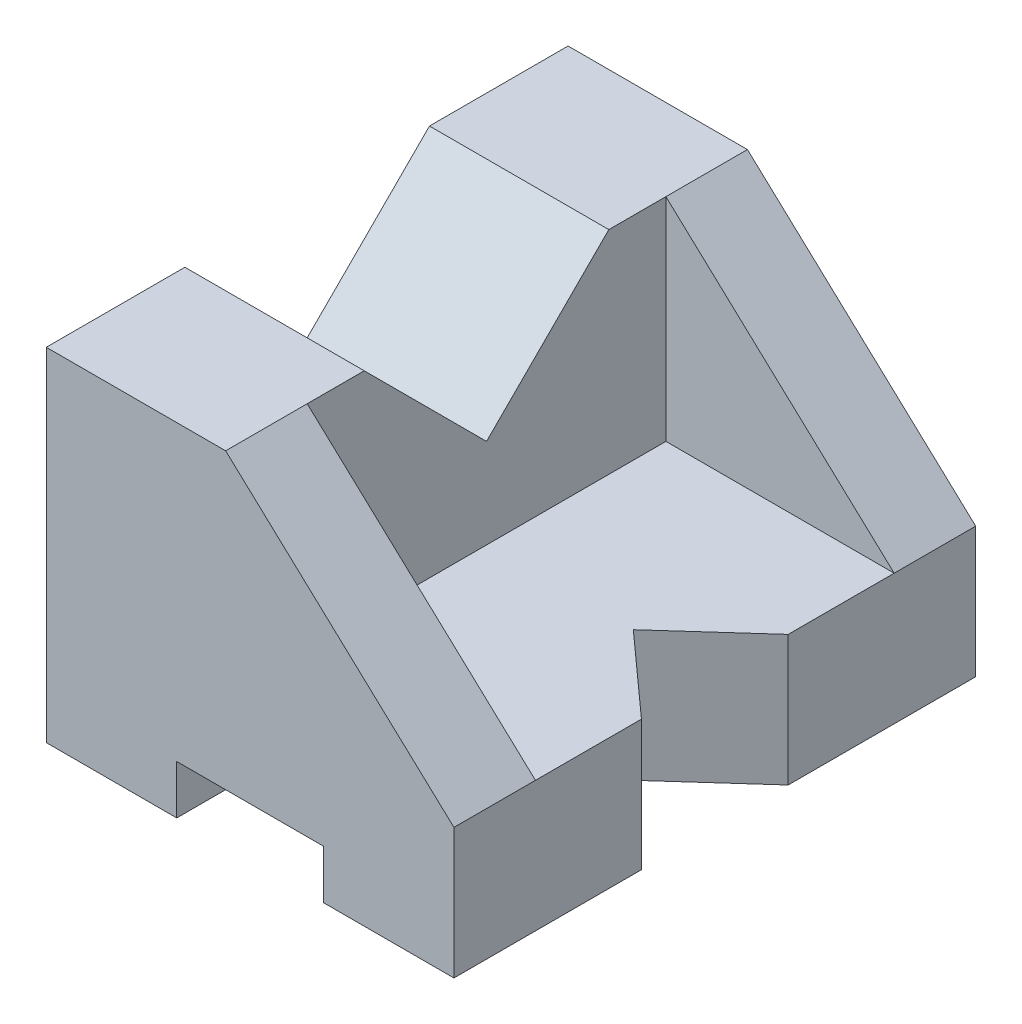
ISO-10303-21;
HEADER;
FILE_DESCRIPTION(('STEP AP214'),'2;1');
FILE_NAME('part.step','',(''),(''),'','','');
FILE_SCHEMA(('AUTOMOTIVE_DESIGN { 1 0 10303 214 1 1 1 1 }'));
ENDSEC;
DATA;
#1=APPLICATION_CONTEXT('core data for automotive mechanical design processes');
#2=APPLICATION_PROTOCOL_DEFINITION('international standard','automotive_design',2000,#1);
#3=PRODUCT_CONTEXT('',#1,'mechanical');
#4=PRODUCT('Part','Part','',(#3));
#5=PRODUCT_RELATED_PRODUCT_CATEGORY('part','',(#4));
#6=PRODUCT_DEFINITION_FORMATION('','',#4);
#7=PRODUCT_DEFINITION_CONTEXT('part definition',#1,'design');
#8=PRODUCT_DEFINITION('design','',#6,#7);
#9=PRODUCT_DEFINITION_SHAPE('','',#8);
#10=(LENGTH_UNIT() NAMED_UNIT(*) SI_UNIT(.MILLI.,.METRE.));
#11=(NAMED_UNIT(*) PLANE_ANGLE_UNIT() SI_UNIT($,.RADIAN.));
#12=(NAMED_UNIT(*) SI_UNIT($,.STERADIAN.) SOLID_ANGLE_UNIT());
#13=UNCERTAINTY_MEASURE_WITH_UNIT(LENGTH_MEASURE(1.E-05),#10,'distance_accuracy_value','');
#14=(GEOMETRIC_REPRESENTATION_CONTEXT(3) GLOBAL_UNCERTAINTY_ASSIGNED_CONTEXT((#13)) GLOBAL_UNIT_ASSIGNED_CONTEXT((#10,
#11,#12)) REPRESENTATION_CONTEXT('',''));
#15=CARTESIAN_POINT('',(0.,0.,0.));
#16=DIRECTION('',(0.,0.,1.));
#17=DIRECTION('',(1.,0.,0.));
#18=AXIS2_PLACEMENT_3D('',#15,#16,#17);
#19=CARTESIAN_POINT('',(50.,16.,-64.));
#20=DIRECTION('',(1.,0.,0.));
#21=DIRECTION('',(0.,0.,-1.));
#22=AXIS2_PLACEMENT_3D('',#19,#20,#21);
#23=PLANE('',#22);
#24=DIRECTION('',(0.,1.,0.));
#25=VECTOR('',#24,1.);
#26=CARTESIAN_POINT('',(50.,0.,-23.));
#27=LINE('',#26,#25);
#28=CARTESIAN_POINT('',(50.,0.,-23.));
#29=VERTEX_POINT('',#28);
#30=CARTESIAN_POINT('',(50.,16.,-23.));
#31=VERTEX_POINT('',#30);
#32=EDGE_CURVE('E163',#29,#31,#27,.T.);
#33=ORIENTED_EDGE('',*,*,#32,.T.);
#34=DIRECTION('',(0.,0.,1.));
#35=VECTOR('',#34,1.);
#36=CARTESIAN_POINT('',(50.,16.,-54.));
#37=LINE('',#36,#35);
#38=CARTESIAN_POINT('',(50.,16.,-10.));
#39=VERTEX_POINT('',#38);
#40=EDGE_CURVE('E230',#31,#39,#37,.T.);
#41=ORIENTED_EDGE('',*,*,#40,.T.);
#42=DIRECTION('',(0.,0.,1.));
#43=VECTOR('',#42,1.);
#44=CARTESIAN_POINT('',(50.,16.,-64.));
#45=LINE('',#44,#43);
#46=CARTESIAN_POINT('',(50.,16.,0.));
#47=VERTEX_POINT('',#46);
#48=EDGE_CURVE('E189',#39,#47,#45,.T.);
#49=ORIENTED_EDGE('',*,*,#48,.T.);
#50=DIRECTION('',(0.,1.,0.));
#51=VECTOR('',#50,1.);
#52=CARTESIAN_POINT('',(50.,16.,0.));
#53=LINE('',#52,#51);
#54=CARTESIAN_POINT('',(50.,0.,0.));
#55=VERTEX_POINT('',#54);
#56=EDGE_CURVE('E184',#55,#47,#53,.T.);
#57=ORIENTED_EDGE('',*,*,#56,.F.);
#58=DIRECTION('',(0.,0.,1.));
#59=VECTOR('',#58,1.);
#60=CARTESIAN_POINT('',(50.,0.,-64.));
#61=LINE('',#60,#59);
#62=EDGE_CURVE('E178',#29,#55,#61,.T.);
#63=ORIENTED_EDGE('',*,*,#62,.F.);
#64=EDGE_LOOP('',(#33,#41,#49,#57,#63));
#65=FACE_BOUND('',#64,.T.);
#66=ADVANCED_FACE('F37',(#65),#23,.T.);
#67=CARTESIAN_POINT('',(0.,42.,-64.));
#68=DIRECTION('',(0.,1.,0.));
#69=DIRECTION('',(0.,0.,1.));
#70=AXIS2_PLACEMENT_3D('',#67,#68,#69);
#71=PLANE('',#70);
#72=DIRECTION('',(1.,0.,0.));
#73=VECTOR('',#72,1.);
#74=CARTESIAN_POINT('',(0.,42.,-17.));
#75=LINE('',#74,#73);
#76=CARTESIAN_POINT('',(0.,42.,-17.));
#77=VERTEX_POINT('',#76);
#78=CARTESIAN_POINT('',(22.,42.,-17.));
#79=VERTEX_POINT('',#78);
#80=EDGE_CURVE('E315',#77,#79,#75,.T.);
#81=ORIENTED_EDGE('',*,*,#80,.F.);
#82=DIRECTION('',(0.,0.,1.));
#83=VECTOR('',#82,1.);
#84=CARTESIAN_POINT('',(0.,42.,-64.));
#85=LINE('',#84,#83);
#86=CARTESIAN_POINT('',(0.,42.,0.));
#87=VERTEX_POINT('',#86);
#88=EDGE_CURVE('E213',#77,#87,#85,.T.);
#89=ORIENTED_EDGE('',*,*,#88,.T.);
#90=DIRECTION('',(-1.,0.,0.));
#91=VECTOR('',#90,1.);
#92=CARTESIAN_POINT('',(0.,42.,0.));
#93=LINE('',#92,#91);
#94=CARTESIAN_POINT('',(22.,42.,0.));
#95=VERTEX_POINT('',#94);
#96=EDGE_CURVE('E237',#95,#87,#93,.T.);
#97=ORIENTED_EDGE('',*,*,#96,.F.);
#98=DIRECTION('',(0.,0.,1.));
#99=VECTOR('',#98,1.);
#100=CARTESIAN_POINT('',(22.,42.,-64.));
#101=LINE('',#100,#99);
#102=CARTESIAN_POINT('',(22.,42.,-10.));
#103=VERTEX_POINT('',#102);
#104=EDGE_CURVE('E219',#103,#95,#101,.T.);
#105=ORIENTED_EDGE('',*,*,#104,.F.);
#106=DIRECTION('',(0.,0.,1.));
#107=VECTOR('',#106,1.);
#108=CARTESIAN_POINT('',(22.,42.,-54.));
#109=LINE('',#108,#107);
#110=EDGE_CURVE('E317',#79,#103,#109,.T.);
#111=ORIENTED_EDGE('',*,*,#110,.F.);
#112=EDGE_LOOP('',(#81,#89,#97,#105,#111));
#113=FACE_BOUND('',#112,.T.);
#114=ADVANCED_FACE('F354',(#113),#71,.T.);
#115=CARTESIAN_POINT('',(22.,42.,-64.));
#116=DIRECTION('',(0.680451099367278,0.732793491626299,0.));
#117=DIRECTION('',(-0.732793491626299,0.680451099367278,0.));
#118=AXIS2_PLACEMENT_3D('',#115,#116,#117);
#119=PLANE('',#118);
#120=CARTESIAN_POINT('',(22.,42.,-64.));
#121=VERTEX_POINT('',#120);
#122=CARTESIAN_POINT('',(22.,42.,-54.));
#123=VERTEX_POINT('',#122);
#124=EDGE_CURVE('E218',#121,#123,#101,.T.);
#125=ORIENTED_EDGE('',*,*,#124,.T.);
#126=DIRECTION('',(0.732793491626299,-0.680451099367278,0.));
#127=VECTOR('',#126,1.);
#128=CARTESIAN_POINT('',(22.,42.,-54.));
#129=LINE('',#128,#127);
#130=CARTESIAN_POINT('',(50.,16.,-54.));
#131=VERTEX_POINT('',#130);
#132=EDGE_CURVE('E45',#123,#131,#129,.T.);
#133=ORIENTED_EDGE('',*,*,#132,.T.);
#134=CARTESIAN_POINT('',(50.,16.,-64.));
#135=VERTEX_POINT('',#134);
#136=EDGE_CURVE('E193',#135,#131,#45,.T.);
#137=ORIENTED_EDGE('',*,*,#136,.F.);
#138=DIRECTION('',(-0.732793491626299,0.680451099367278,0.));
#139=VECTOR('',#138,1.);
#140=CARTESIAN_POINT('',(22.,42.,-64.));
#141=LINE('',#140,#139);
#142=EDGE_CURVE('E271',#135,#121,#141,.T.);
#143=ORIENTED_EDGE('',*,*,#142,.T.);
#144=EDGE_LOOP('',(#125,#133,#137,#143));
#145=FACE_BOUND('',#144,.T.);
#146=ADVANCED_FACE('F373',(#145),#119,.T.);
#147=CARTESIAN_POINT('',(16.,0.,-64.));
#148=DIRECTION('',(0.,-1.,0.));
#149=DIRECTION('',(1.,0.,0.));
#150=AXIS2_PLACEMENT_3D('',#147,#148,#149);
#151=PLANE('',#150);
#152=DIRECTION('',(1.,0.,0.));
#153=VECTOR('',#152,1.);
#154=CARTESIAN_POINT('',(16.,0.,0.));
#155=LINE('',#154,#153);
#156=CARTESIAN_POINT('',(0.,0.,0.));
#157=VERTEX_POINT('',#156);
#158=CARTESIAN_POINT('',(16.,0.,0.));
#159=VERTEX_POINT('',#158);
#160=EDGE_CURVE('E277',#157,#159,#155,.T.);
#161=ORIENTED_EDGE('',*,*,#160,.F.);
#162=DIRECTION('',(0.,0.,1.));
#163=VECTOR('',#162,1.);
#164=CARTESIAN_POINT('',(0.,0.,-64.));
#165=LINE('',#164,#163);
#166=CARTESIAN_POINT('',(0.,0.,-64.));
#167=VERTEX_POINT('',#166);
#168=EDGE_CURVE('E202',#167,#157,#165,.T.);
#169=ORIENTED_EDGE('',*,*,#168,.F.);
#170=DIRECTION('',(1.,0.,0.));
#171=VECTOR('',#170,1.);
#172=CARTESIAN_POINT('',(16.,0.,-64.));
#173=LINE('',#172,#171);
#174=CARTESIAN_POINT('',(16.,0.,-64.));
#175=VERTEX_POINT('',#174);
#176=EDGE_CURVE('E248',#167,#175,#173,.T.);
#177=ORIENTED_EDGE('',*,*,#176,.T.);
#178=DIRECTION('',(0.,0.,1.));
#179=VECTOR('',#178,1.);
#180=CARTESIAN_POINT('',(16.,0.,-64.));
#181=LINE('',#180,#179);
#182=EDGE_CURVE('E199',#175,#159,#181,.T.);
#183=ORIENTED_EDGE('',*,*,#182,.T.);
#184=EDGE_LOOP('',(#161,#169,#177,#183));
#185=FACE_BOUND('',#184,.T.);
#186=ADVANCED_FACE('F39',(#185),#151,.T.);
#187=CARTESIAN_POINT('',(0.,0.,-64.));
#188=DIRECTION('',(-1.,0.,0.));
#189=DIRECTION('',(0.,0.,1.));
#190=AXIS2_PLACEMENT_3D('',#187,#188,#189);
#191=PLANE('',#190);
#192=DIRECTION('',(0.,-0.707106781186548,-0.707106781186547));
#193=VECTOR('',#192,1.);
#194=CARTESIAN_POINT('',(0.,42.,-17.));
#195=LINE('',#194,#193);
#196=CARTESIAN_POINT('',(0.,27.,-32.));
#197=VERTEX_POINT('',#196);
#198=EDGE_CURVE('E305',#77,#197,#195,.T.);
#199=ORIENTED_EDGE('',*,*,#198,.T.);
#200=DIRECTION('',(0.,0.707106781186548,-0.707106781186547));
#201=VECTOR('',#200,1.);
#202=CARTESIAN_POINT('',(0.,27.,-32.));
#203=LINE('',#202,#201);
#204=CARTESIAN_POINT('',(0.,42.,-47.));
#205=VERTEX_POINT('',#204);
#206=EDGE_CURVE('E308',#197,#205,#203,.T.);
#207=ORIENTED_EDGE('',*,*,#206,.T.);
#208=CARTESIAN_POINT('',(0.,42.,-64.));
#209=VERTEX_POINT('',#208);
#210=EDGE_CURVE('E206',#209,#205,#85,.T.);
#211=ORIENTED_EDGE('',*,*,#210,.F.);
#212=DIRECTION('',(0.,-1.,0.));
#213=VECTOR('',#212,1.);
#214=CARTESIAN_POINT('',(0.,0.,-64.));
#215=LINE('',#214,#213);
#216=EDGE_CURVE('E200',#209,#167,#215,.T.);
#217=ORIENTED_EDGE('',*,*,#216,.T.);
#218=ORIENTED_EDGE('',*,*,#168,.T.);
#219=DIRECTION('',(0.,-1.,0.));
#220=VECTOR('',#219,1.);
#221=CARTESIAN_POINT('',(0.,0.,0.));
#222=LINE('',#221,#220);
#223=EDGE_CURVE('E216',#87,#157,#222,.T.);
#224=ORIENTED_EDGE('',*,*,#223,.F.);
#225=ORIENTED_EDGE('',*,*,#88,.F.);
#226=EDGE_LOOP('',(#199,#207,#211,#217,#218,#224,#225));
#227=FACE_BOUND('',#226,.T.);
#228=ADVANCED_FACE('F348',(#227),#191,.T.);
#229=DIRECTION('',(1.,0.,0.));
#230=VECTOR('',#229,1.);
#231=CARTESIAN_POINT('',(0.,42.,-47.));
#232=LINE('',#231,#230);
#233=CARTESIAN_POINT('',(22.,42.,-47.));
#234=VERTEX_POINT('',#233);
#235=EDGE_CURVE('E318',#205,#234,#232,.T.);
#236=ORIENTED_EDGE('',*,*,#235,.T.);
#237=EDGE_CURVE('E324',#123,#234,#109,.T.);
#238=ORIENTED_EDGE('',*,*,#237,.F.);
#239=ORIENTED_EDGE('',*,*,#124,.F.);
#240=DIRECTION('',(-1.,0.,0.));
#241=VECTOR('',#240,1.);
#242=CARTESIAN_POINT('',(0.,42.,-64.));
#243=LINE('',#242,#241);
#244=EDGE_CURVE('E273',#121,#209,#243,.T.);
#245=ORIENTED_EDGE('',*,*,#244,.T.);
#246=ORIENTED_EDGE('',*,*,#210,.T.);
#247=EDGE_LOOP('',(#236,#238,#239,#245,#246));
#248=FACE_BOUND('',#247,.T.);
#249=ADVANCED_FACE('F344',(#248),#71,.T.);
#250=DIRECTION('',(0.732793491626299,-0.680451099367278,0.));
#251=VECTOR('',#250,1.);
#252=CARTESIAN_POINT('',(22.,42.,-10.));
#253=LINE('',#252,#251);
#254=EDGE_CURVE('E11',#103,#39,#253,.T.);
#255=ORIENTED_EDGE('',*,*,#254,.F.);
#256=ORIENTED_EDGE('',*,*,#104,.T.);
#257=DIRECTION('',(-0.732793491626299,0.680451099367278,0.));
#258=VECTOR('',#257,1.);
#259=CARTESIAN_POINT('',(22.,42.,0.));
#260=LINE('',#259,#258);
#261=EDGE_CURVE('E233',#47,#95,#260,.T.);
#262=ORIENTED_EDGE('',*,*,#261,.F.);
#263=ORIENTED_EDGE('',*,*,#48,.F.);
#264=EDGE_LOOP('',(#255,#256,#262,#263));
#265=FACE_BOUND('',#264,.T.);
#266=ADVANCED_FACE('F234',(#265),#119,.T.);
#267=DIRECTION('',(0.,1.,0.));
#268=VECTOR('',#267,1.);
#269=CARTESIAN_POINT('',(50.,0.,-41.));
#270=LINE('',#269,#268);
#271=CARTESIAN_POINT('',(50.,0.,-41.));
#272=VERTEX_POINT('',#271);
#273=CARTESIAN_POINT('',(50.,16.,-41.));
#274=VERTEX_POINT('',#273);
#275=EDGE_CURVE('E52',#272,#274,#270,.T.);
#276=ORIENTED_EDGE('',*,*,#275,.F.);
#277=CARTESIAN_POINT('',(50.,0.,-64.));
#278=VERTEX_POINT('',#277);
#279=EDGE_CURVE('E186',#278,#272,#61,.T.);
#280=ORIENTED_EDGE('',*,*,#279,.F.);
#281=DIRECTION('',(0.,1.,0.));
#282=VECTOR('',#281,1.);
#283=CARTESIAN_POINT('',(50.,16.,-64.));
#284=LINE('',#283,#282);
#285=EDGE_CURVE('E269',#278,#135,#284,.T.);
#286=ORIENTED_EDGE('',*,*,#285,.T.);
#287=ORIENTED_EDGE('',*,*,#136,.T.);
#288=EDGE_CURVE('E299',#131,#274,#37,.T.);
#289=ORIENTED_EDGE('',*,*,#288,.T.);
#290=EDGE_LOOP('',(#276,#280,#286,#287,#289));
#291=FACE_BOUND('',#290,.T.);
#292=ADVANCED_FACE('F297',(#291),#23,.T.);
#293=CARTESIAN_POINT('',(50.,0.,-64.));
#294=DIRECTION('',(0.,-1.,0.));
#295=DIRECTION('',(1.,0.,0.));
#296=AXIS2_PLACEMENT_3D('',#293,#294,#295);
#297=PLANE('',#296);
#298=DIRECTION('',(0.743294146247166,0.,0.66896473162245));
#299=VECTOR('',#298,1.);
#300=CARTESIAN_POINT('',(50.,0.,-23.));
#301=LINE('',#300,#299);
#302=CARTESIAN_POINT('',(40.,0.,-32.));
#303=VERTEX_POINT('',#302);
#304=EDGE_CURVE('E166',#303,#29,#301,.T.);
#305=ORIENTED_EDGE('',*,*,#304,.T.);
#306=ORIENTED_EDGE('',*,*,#62,.T.);
#307=DIRECTION('',(1.,0.,0.));
#308=VECTOR('',#307,1.);
#309=CARTESIAN_POINT('',(50.,0.,0.));
#310=LINE('',#309,#308);
#311=CARTESIAN_POINT('',(34.,0.,0.));
#312=VERTEX_POINT('',#311);
#313=EDGE_CURVE('E242',#312,#55,#310,.T.);
#314=ORIENTED_EDGE('',*,*,#313,.F.);
#315=DIRECTION('',(0.,0.,1.));
#316=VECTOR('',#315,1.);
#317=CARTESIAN_POINT('',(34.,0.,-64.));
#318=LINE('',#317,#316);
#319=CARTESIAN_POINT('',(34.,0.,-64.));
#320=VERTEX_POINT('',#319);
#321=EDGE_CURVE('E187',#320,#312,#318,.T.);
#322=ORIENTED_EDGE('',*,*,#321,.F.);
#323=DIRECTION('',(1.,0.,0.));
#324=VECTOR('',#323,1.);
#325=CARTESIAN_POINT('',(50.,0.,-64.));
#326=LINE('',#325,#324);
#327=EDGE_CURVE('E266',#320,#278,#326,.T.);
#328=ORIENTED_EDGE('',*,*,#327,.T.);
#329=ORIENTED_EDGE('',*,*,#279,.T.);
#330=DIRECTION('',(-0.743294146247166,0.,0.66896473162245));
#331=VECTOR('',#330,1.);
#332=CARTESIAN_POINT('',(40.,0.,-32.));
#333=LINE('',#332,#331);
#334=EDGE_CURVE('E173',#272,#303,#333,.T.);
#335=ORIENTED_EDGE('',*,*,#334,.T.);
#336=EDGE_LOOP('',(#305,#306,#314,#322,#328,#329,#335));
#337=FACE_BOUND('',#336,.T.);
#338=ADVANCED_FACE('F176',(#337),#297,.T.);
#339=CARTESIAN_POINT('',(34.,0.,-64.));
#340=DIRECTION('',(-1.,0.,0.));
#341=DIRECTION('',(0.,0.,1.));
#342=AXIS2_PLACEMENT_3D('',#339,#340,#341);
#343=PLANE('',#342);
#344=DIRECTION('',(0.,-1.,0.));
#345=VECTOR('',#344,1.);
#346=CARTESIAN_POINT('',(34.,0.,0.));
#347=LINE('',#346,#345);
#348=CARTESIAN_POINT('',(34.,6.,0.));
#349=VERTEX_POINT('',#348);
#350=EDGE_CURVE('E244',#349,#312,#347,.T.);
#351=ORIENTED_EDGE('',*,*,#350,.F.);
#352=DIRECTION('',(0.,0.,1.));
#353=VECTOR('',#352,1.);
#354=CARTESIAN_POINT('',(34.,6.,-64.));
#355=LINE('',#354,#353);
#356=CARTESIAN_POINT('',(34.,6.,-64.));
#357=VERTEX_POINT('',#356);
#358=EDGE_CURVE('E190',#357,#349,#355,.T.);
#359=ORIENTED_EDGE('',*,*,#358,.F.);
#360=DIRECTION('',(0.,-1.,0.));
#361=VECTOR('',#360,1.);
#362=CARTESIAN_POINT('',(34.,0.,-64.));
#363=LINE('',#362,#361);
#364=EDGE_CURVE('E263',#357,#320,#363,.T.);
#365=ORIENTED_EDGE('',*,*,#364,.T.);
#366=ORIENTED_EDGE('',*,*,#321,.T.);
#367=EDGE_LOOP('',(#351,#359,#365,#366));
#368=FACE_BOUND('',#367,.T.);
#369=ADVANCED_FACE('F288',(#368),#343,.T.);
#370=CARTESIAN_POINT('',(34.,6.,-64.));
#371=DIRECTION('',(0.,-1.,0.));
#372=DIRECTION('',(1.,0.,0.));
#373=AXIS2_PLACEMENT_3D('',#370,#371,#372);
#374=PLANE('',#373);
#375=DIRECTION('',(1.,0.,0.));
#376=VECTOR('',#375,1.);
#377=CARTESIAN_POINT('',(34.,6.,0.));
#378=LINE('',#377,#376);
#379=CARTESIAN_POINT('',(16.,5.99999999999999,0.));
#380=VERTEX_POINT('',#379);
#381=EDGE_CURVE('E283',#380,#349,#378,.T.);
#382=ORIENTED_EDGE('',*,*,#381,.F.);
#383=DIRECTION('',(0.,0.,1.));
#384=VECTOR('',#383,1.);
#385=CARTESIAN_POINT('',(16.,5.99999999999999,-64.));
#386=LINE('',#385,#384);
#387=CARTESIAN_POINT('',(16.,5.99999999999999,-64.));
#388=VERTEX_POINT('',#387);
#389=EDGE_CURVE('E197',#388,#380,#386,.T.);
#390=ORIENTED_EDGE('',*,*,#389,.F.);
#391=DIRECTION('',(1.,0.,0.));
#392=VECTOR('',#391,1.);
#393=CARTESIAN_POINT('',(34.,6.,-64.));
#394=LINE('',#393,#392);
#395=EDGE_CURVE('E255',#388,#357,#394,.T.);
#396=ORIENTED_EDGE('',*,*,#395,.T.);
#397=ORIENTED_EDGE('',*,*,#358,.T.);
#398=EDGE_LOOP('',(#382,#390,#396,#397));
#399=FACE_BOUND('',#398,.T.);
#400=ADVANCED_FACE('F398',(#399),#374,.T.);
#401=CARTESIAN_POINT('',(16.,5.99999999999999,-64.));
#402=DIRECTION('',(1.,0.,0.));
#403=DIRECTION('',(0.,0.,-1.));
#404=AXIS2_PLACEMENT_3D('',#401,#402,#403);
#405=PLANE('',#404);
#406=DIRECTION('',(0.,1.,0.));
#407=VECTOR('',#406,1.);
#408=CARTESIAN_POINT('',(16.,5.99999999999999,0.));
#409=LINE('',#408,#407);
#410=EDGE_CURVE('E279',#159,#380,#409,.T.);
#411=ORIENTED_EDGE('',*,*,#410,.F.);
#412=ORIENTED_EDGE('',*,*,#182,.F.);
#413=DIRECTION('',(0.,1.,0.));
#414=VECTOR('',#413,1.);
#415=CARTESIAN_POINT('',(16.,5.99999999999999,-64.));
#416=LINE('',#415,#414);
#417=EDGE_CURVE('E250',#175,#388,#416,.T.);
#418=ORIENTED_EDGE('',*,*,#417,.T.);
#419=ORIENTED_EDGE('',*,*,#389,.T.);
#420=EDGE_LOOP('',(#411,#412,#418,#419));
#421=FACE_BOUND('',#420,.T.);
#422=ADVANCED_FACE('F395',(#421),#405,.T.);
#423=CARTESIAN_POINT('',(0.,0.,-64.));
#424=DIRECTION('',(0.,0.,-1.));
#425=DIRECTION('',(-1.,0.,0.));
#426=AXIS2_PLACEMENT_3D('',#423,#424,#425);
#427=PLANE('',#426);
#428=ORIENTED_EDGE('',*,*,#176,.F.);
#429=ORIENTED_EDGE('',*,*,#216,.F.);
#430=ORIENTED_EDGE('',*,*,#244,.F.);
#431=ORIENTED_EDGE('',*,*,#142,.F.);
#432=ORIENTED_EDGE('',*,*,#285,.F.);
#433=ORIENTED_EDGE('',*,*,#327,.F.);
#434=ORIENTED_EDGE('',*,*,#364,.F.);
#435=ORIENTED_EDGE('',*,*,#395,.F.);
#436=ORIENTED_EDGE('',*,*,#417,.F.);
#437=EDGE_LOOP('',(#428,#429,#430,#431,#432,#433,#434,#435,#436));
#438=FACE_BOUND('',#437,.T.);
#439=ADVANCED_FACE('F293',(#438),#427,.T.);
#440=CARTESIAN_POINT('',(0.,0.,0.));
#441=DIRECTION('',(0.,0.,-1.));
#442=DIRECTION('',(-1.,0.,0.));
#443=AXIS2_PLACEMENT_3D('',#440,#441,#442);
#444=PLANE('',#443);
#445=ORIENTED_EDGE('',*,*,#160,.T.);
#446=ORIENTED_EDGE('',*,*,#410,.T.);
#447=ORIENTED_EDGE('',*,*,#381,.T.);
#448=ORIENTED_EDGE('',*,*,#350,.T.);
#449=ORIENTED_EDGE('',*,*,#313,.T.);
#450=ORIENTED_EDGE('',*,*,#56,.T.);
#451=ORIENTED_EDGE('',*,*,#261,.T.);
#452=ORIENTED_EDGE('',*,*,#96,.T.);
#453=ORIENTED_EDGE('',*,*,#223,.T.);
#454=EDGE_LOOP('',(#445,#446,#447,#448,#449,#450,#451,#452,#453));
#455=FACE_BOUND('',#454,.T.);
#456=ADVANCED_FACE('F240',(#455),#444,.F.);
#457=CARTESIAN_POINT('',(22.,16.,-10.));
#458=DIRECTION('',(0.,0.,1.));
#459=DIRECTION('',(1.,0.,0.));
#460=AXIS2_PLACEMENT_3D('',#457,#458,#459);
#461=PLANE('',#460);
#462=ORIENTED_EDGE('',*,*,#254,.T.);
#463=DIRECTION('',(1.,0.,0.));
#464=VECTOR('',#463,1.);
#465=CARTESIAN_POINT('',(22.,16.,-10.));
#466=LINE('',#465,#464);
#467=CARTESIAN_POINT('',(22.,16.,-10.));
#468=VERTEX_POINT('',#467);
#469=EDGE_CURVE('E322',#468,#39,#466,.T.);
#470=ORIENTED_EDGE('',*,*,#469,.F.);
#471=DIRECTION('',(0.,1.,0.));
#472=VECTOR('',#471,1.);
#473=CARTESIAN_POINT('',(22.,16.,-10.));
#474=LINE('',#473,#472);
#475=EDGE_CURVE('E280',#468,#103,#474,.T.);
#476=ORIENTED_EDGE('',*,*,#475,.T.);
#477=EDGE_LOOP('',(#462,#470,#476));
#478=FACE_BOUND('',#477,.T.);
#479=ADVANCED_FACE('F355',(#478),#461,.F.);
#480=CARTESIAN_POINT('',(22.,16.,-54.));
#481=DIRECTION('',(-1.,0.,0.));
#482=DIRECTION('',(0.,0.,1.));
#483=AXIS2_PLACEMENT_3D('',#480,#481,#482);
#484=PLANE('',#483);
#485=DIRECTION('',(0.,0.707106781186548,-0.707106781186547));
#486=VECTOR('',#485,1.);
#487=CARTESIAN_POINT('',(22.,27.,-32.));
#488=LINE('',#487,#486);
#489=CARTESIAN_POINT('',(22.,27.,-32.));
#490=VERTEX_POINT('',#489);
#491=EDGE_CURVE('E309',#490,#234,#488,.T.);
#492=ORIENTED_EDGE('',*,*,#491,.F.);
#493=DIRECTION('',(0.,-0.707106781186548,-0.707106781186547));
#494=VECTOR('',#493,1.);
#495=CARTESIAN_POINT('',(22.,42.,-17.));
#496=LINE('',#495,#494);
#497=EDGE_CURVE('E60',#79,#490,#496,.T.);
#498=ORIENTED_EDGE('',*,*,#497,.F.);
#499=ORIENTED_EDGE('',*,*,#110,.T.);
#500=ORIENTED_EDGE('',*,*,#475,.F.);
#501=DIRECTION('',(0.,0.,1.));
#502=VECTOR('',#501,1.);
#503=CARTESIAN_POINT('',(22.,16.,-54.));
#504=LINE('',#503,#502);
#505=CARTESIAN_POINT('',(22.,16.,-54.));
#506=VERTEX_POINT('',#505);
#507=EDGE_CURVE('E328',#506,#468,#504,.T.);
#508=ORIENTED_EDGE('',*,*,#507,.F.);
#509=DIRECTION('',(0.,1.,0.));
#510=VECTOR('',#509,1.);
#511=CARTESIAN_POINT('',(22.,16.,-54.));
#512=LINE('',#511,#510);
#513=EDGE_CURVE('E258',#506,#123,#512,.T.);
#514=ORIENTED_EDGE('',*,*,#513,.T.);
#515=ORIENTED_EDGE('',*,*,#237,.T.);
#516=EDGE_LOOP('',(#492,#498,#499,#500,#508,#514,#515));
#517=FACE_BOUND('',#516,.T.);
#518=ADVANCED_FACE('F340',(#517),#484,.F.);
#519=CARTESIAN_POINT('',(22.,16.,-54.));
#520=DIRECTION('',(0.,0.,1.));
#521=DIRECTION('',(1.,0.,0.));
#522=AXIS2_PLACEMENT_3D('',#519,#520,#521);
#523=PLANE('',#522);
#524=ORIENTED_EDGE('',*,*,#513,.F.);
#525=DIRECTION('',(1.,0.,0.));
#526=VECTOR('',#525,1.);
#527=CARTESIAN_POINT('',(22.,16.,-54.));
#528=LINE('',#527,#526);
#529=EDGE_CURVE('E326',#506,#131,#528,.T.);
#530=ORIENTED_EDGE('',*,*,#529,.T.);
#531=ORIENTED_EDGE('',*,*,#132,.F.);
#532=EDGE_LOOP('',(#524,#530,#531));
#533=FACE_BOUND('',#532,.T.);
#534=ADVANCED_FACE('F358',(#533),#523,.T.);
#535=CARTESIAN_POINT('',(0.,16.,0.));
#536=DIRECTION('',(0.,-1.,0.));
#537=DIRECTION('',(0.,0.,-1.));
#538=AXIS2_PLACEMENT_3D('',#535,#536,#537);
#539=PLANE('',#538);
#540=ORIENTED_EDGE('',*,*,#40,.F.);
#541=DIRECTION('',(0.743294146247166,0.,0.66896473162245));
#542=VECTOR('',#541,1.);
#543=CARTESIAN_POINT('',(50.,16.,-23.));
#544=LINE('',#543,#542);
#545=CARTESIAN_POINT('',(40.,16.,-32.));
#546=VERTEX_POINT('',#545);
#547=EDGE_CURVE('E169',#546,#31,#544,.T.);
#548=ORIENTED_EDGE('',*,*,#547,.F.);
#549=DIRECTION('',(-0.743294146247166,0.,0.66896473162245));
#550=VECTOR('',#549,1.);
#551=CARTESIAN_POINT('',(40.,16.,-32.));
#552=LINE('',#551,#550);
#553=EDGE_CURVE('E181',#274,#546,#552,.T.);
#554=ORIENTED_EDGE('',*,*,#553,.F.);
#555=ORIENTED_EDGE('',*,*,#288,.F.);
#556=ORIENTED_EDGE('',*,*,#529,.F.);
#557=ORIENTED_EDGE('',*,*,#507,.T.);
#558=ORIENTED_EDGE('',*,*,#469,.T.);
#559=EDGE_LOOP('',(#540,#548,#554,#555,#556,#557,#558));
#560=FACE_BOUND('',#559,.T.);
#561=ADVANCED_FACE('F357',(#560),#539,.F.);
#562=CARTESIAN_POINT('',(0.,42.,-17.));
#563=DIRECTION('',(0.,-0.707106781186547,0.707106781186548));
#564=DIRECTION('',(0.,-0.707106781186548,-0.707106781186547));
#565=AXIS2_PLACEMENT_3D('',#562,#563,#564);
#566=PLANE('',#565);
#567=ORIENTED_EDGE('',*,*,#497,.T.);
#568=DIRECTION('',(1.,0.,0.));
#569=VECTOR('',#568,1.);
#570=CARTESIAN_POINT('',(0.,27.,-32.));
#571=LINE('',#570,#569);
#572=EDGE_CURVE('E312',#197,#490,#571,.T.);
#573=ORIENTED_EDGE('',*,*,#572,.F.);
#574=ORIENTED_EDGE('',*,*,#198,.F.);
#575=ORIENTED_EDGE('',*,*,#80,.T.);
#576=EDGE_LOOP('',(#567,#573,#574,#575));
#577=FACE_BOUND('',#576,.T.);
#578=ADVANCED_FACE('F351',(#577),#566,.F.);
#579=CARTESIAN_POINT('',(0.,27.,-32.));
#580=DIRECTION('',(0.,-0.707106781186547,-0.707106781186548));
#581=DIRECTION('',(0.,0.707106781186548,-0.707106781186547));
#582=AXIS2_PLACEMENT_3D('',#579,#580,#581);
#583=PLANE('',#582);
#584=ORIENTED_EDGE('',*,*,#491,.T.);
#585=ORIENTED_EDGE('',*,*,#235,.F.);
#586=ORIENTED_EDGE('',*,*,#206,.F.);
#587=ORIENTED_EDGE('',*,*,#572,.T.);
#588=EDGE_LOOP('',(#584,#585,#586,#587));
#589=FACE_BOUND('',#588,.T.);
#590=ADVANCED_FACE('F347',(#589),#583,.F.);
#591=CARTESIAN_POINT('',(50.,0.,-23.));
#592=DIRECTION('',(-0.66896473162245,0.,0.743294146247166));
#593=DIRECTION('',(0.743294146247166,0.,0.66896473162245));
#594=AXIS2_PLACEMENT_3D('',#591,#592,#593);
#595=PLANE('',#594);
#596=ORIENTED_EDGE('',*,*,#547,.T.);
#597=ORIENTED_EDGE('',*,*,#32,.F.);
#598=ORIENTED_EDGE('',*,*,#304,.F.);
#599=DIRECTION('',(0.,1.,0.));
#600=VECTOR('',#599,1.);
#601=CARTESIAN_POINT('',(40.,0.,-32.));
#602=LINE('',#601,#600);
#603=EDGE_CURVE('E300',#303,#546,#602,.T.);
#604=ORIENTED_EDGE('',*,*,#603,.T.);
#605=EDGE_LOOP('',(#596,#597,#598,#604));
#606=FACE_BOUND('',#605,.T.);
#607=ADVANCED_FACE('F165',(#606),#595,.F.);
#608=CARTESIAN_POINT('',(40.,0.,-32.));
#609=DIRECTION('',(-0.66896473162245,0.,-0.743294146247166));
#610=DIRECTION('',(-0.743294146247166,0.,0.66896473162245));
#611=AXIS2_PLACEMENT_3D('',#608,#609,#610);
#612=PLANE('',#611);
#613=ORIENTED_EDGE('',*,*,#553,.T.);
#614=ORIENTED_EDGE('',*,*,#603,.F.);
#615=ORIENTED_EDGE('',*,*,#334,.F.);
#616=ORIENTED_EDGE('',*,*,#275,.T.);
#617=EDGE_LOOP('',(#613,#614,#615,#616));
#618=FACE_BOUND('',#617,.T.);
#619=ADVANCED_FACE('F435',(#618),#612,.F.);
#620=CLOSED_SHELL('',(#66,#114,#146,#186,#228,#249,#266,#292,#338,#369,#400,#422,#439,#456,#479,
#518,#534,#561,#578,#590,#607,#619));
#621=MANIFOLD_SOLID_BREP('B2',#620);
#622=ADVANCED_BREP_SHAPE_REPRESENTATION('',(#18,#621),#14);
#623=SHAPE_DEFINITION_REPRESENTATION(#9,#622);
ENDSEC;
END-ISO-10303-21;
